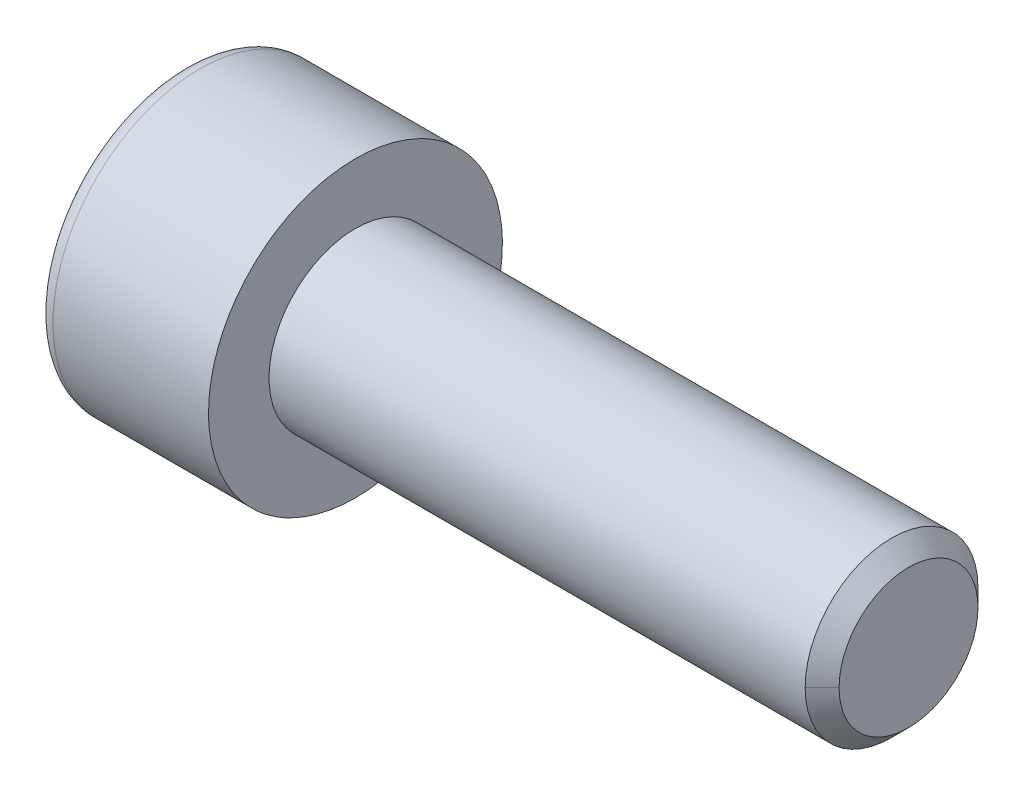
ISO-10303-21;
HEADER;
FILE_DESCRIPTION(('STEP AP214'),'2;1');
FILE_NAME('part.step','',(''),(''),'','','');
FILE_SCHEMA(('AUTOMOTIVE_DESIGN { 1 0 10303 214 1 1 1 1 }'));
ENDSEC;
DATA;
#1=APPLICATION_CONTEXT('core data for automotive mechanical design processes');
#2=APPLICATION_PROTOCOL_DEFINITION('international standard','automotive_design',2000,#1);
#3=PRODUCT_CONTEXT('',#1,'mechanical');
#4=PRODUCT('Part','Part','',(#3));
#5=PRODUCT_RELATED_PRODUCT_CATEGORY('part','',(#4));
#6=PRODUCT_DEFINITION_FORMATION('','',#4);
#7=PRODUCT_DEFINITION_CONTEXT('part definition',#1,'design');
#8=PRODUCT_DEFINITION('design','',#6,#7);
#9=PRODUCT_DEFINITION_SHAPE('','',#8);
#10=(LENGTH_UNIT() NAMED_UNIT(*) SI_UNIT(.MILLI.,.METRE.));
#11=(NAMED_UNIT(*) PLANE_ANGLE_UNIT() SI_UNIT($,.RADIAN.));
#12=(NAMED_UNIT(*) SI_UNIT($,.STERADIAN.) SOLID_ANGLE_UNIT());
#13=UNCERTAINTY_MEASURE_WITH_UNIT(LENGTH_MEASURE(1.E-05),#10,'distance_accuracy_value','');
#14=(GEOMETRIC_REPRESENTATION_CONTEXT(3) GLOBAL_UNCERTAINTY_ASSIGNED_CONTEXT((#13)) GLOBAL_UNIT_ASSIGNED_CONTEXT((#10,
#11,#12)) REPRESENTATION_CONTEXT('',''));
#15=CARTESIAN_POINT('',(0.,0.,0.));
#16=DIRECTION('',(0.,0.,1.));
#17=DIRECTION('',(1.,0.,0.));
#18=AXIS2_PLACEMENT_3D('',#15,#16,#17);
#19=CARTESIAN_POINT('',(16.,-2.03335088,-2.03335088));
#20=DIRECTION('',(1.,0.,0.));
#21=DIRECTION('',(0.,1.,0.));
#22=AXIS2_PLACEMENT_3D('',#19,#20,#21);
#23=PLANE('',#22);
#24=CARTESIAN_POINT('',(16.,0.,0.));
#25=DIRECTION('',(-1.,0.,0.));
#26=DIRECTION('',(0.,0.,1.));
#27=AXIS2_PLACEMENT_3D('',#24,#25,#26);
#28=CIRCLE('',#27,2.00924);
#29=CARTESIAN_POINT('',(16.,-6.86836687895213E-10,-2.00923999999999));
#30=VERTEX_POINT('',#29);
#31=CARTESIAN_POINT('',(16.,-2.40554743613262E-10,2.00923999999999));
#32=VERTEX_POINT('',#31);
#33=EDGE_CURVE('E88',#30,#32,#28,.F.);
#34=ORIENTED_EDGE('',*,*,#33,.T.);
#35=CARTESIAN_POINT('',(16.,0.,0.));
#36=DIRECTION('',(-1.,0.,0.));
#37=DIRECTION('',(0.,0.,1.));
#38=AXIS2_PLACEMENT_3D('',#35,#36,#37);
#39=CIRCLE('',#38,2.00924);
#40=EDGE_CURVE('E21',#32,#30,#39,.F.);
#41=ORIENTED_EDGE('',*,*,#40,.T.);
#42=EDGE_LOOP('',(#34,#41));
#43=FACE_BOUND('',#42,.T.);
#44=ADVANCED_FACE('F17',(#43),#23,.T.);
#45=CARTESIAN_POINT('',(16.,0.,2.00924));
#46=CARTESIAN_POINT('',(15.50924,0.,2.5));
#47=(BOUNDED_CURVE() B_SPLINE_CURVE(1,(#45,#46),.UNSPECIFIED.,.F.,
.F.) B_SPLINE_CURVE_WITH_KNOTS((2,2),(0.,1.00000000000005),
.UNSPECIFIED.) CURVE() GEOMETRIC_REPRESENTATION_ITEM() RATIONAL_B_SPLINE_CURVE((1.,1.)) REPRESENTATION_ITEM(''));
#48=CARTESIAN_POINT('',(1015.50924,0.,0.));
#49=DIRECTION('',(-1.,0.,0.));
#50=AXIS1_PLACEMENT('',#48,#49);
#51=SURFACE_OF_REVOLUTION('',#47,#50);
#52=ORIENTED_EDGE('',*,*,#40,.F.);
#53=DIRECTION('',(-0.707106781186547,-1.26986739101621E-10,0.707106781186548));
#54=VECTOR('',#53,1.);
#55=CARTESIAN_POINT('',(15.75462,-4.04899018551151E-10,2.25462));
#56=LINE('',#55,#54);
#57=CARTESIAN_POINT('',(15.50924,-2.244829608488E-10,2.49999999999995));
#58=VERTEX_POINT('',#57);
#59=EDGE_CURVE('E91',#32,#58,#56,.T.);
#60=ORIENTED_EDGE('',*,*,#59,.T.);
#61=CARTESIAN_POINT('',(15.5092400000001,0.,0.));
#62=DIRECTION('',(-1.,0.,0.));
#63=DIRECTION('',(0.,0.,1.));
#64=AXIS2_PLACEMENT_3D('',#61,#62,#63);
#65=CIRCLE('',#64,2.5);
#66=CARTESIAN_POINT('',(15.50924,-1.02551714257664E-09,-2.49999999999995));
#67=VERTEX_POINT('',#66);
#68=EDGE_CURVE('E95',#58,#67,#65,.F.);
#69=ORIENTED_EDGE('',*,*,#68,.T.);
#70=DIRECTION('',(0.707106781186547,2.90060050295602E-10,0.707106781186548));
#71=VECTOR('',#70,1.);
#72=CARTESIAN_POINT('',(15.75462,-9.24860583998472E-10,-2.25462));
#73=LINE('',#72,#71);
#74=EDGE_CURVE('E93',#67,#30,#73,.T.);
#75=ORIENTED_EDGE('',*,*,#74,.T.);
#76=EDGE_LOOP('',(#52,#60,#69,#75));
#77=FACE_BOUND('',#76,.T.);
#78=ADVANCED_FACE('F94',(#77),#51,.T.);
#79=CARTESIAN_POINT('',(16.0001414213562,0.,2.00909857864376));
#80=CARTESIAN_POINT('',(16.,0.,2.00924));
#81=CARTESIAN_POINT('',(15.50924,0.,2.5));
#82=(BOUNDED_CURVE() B_SPLINE_CURVE(1,(#79,#80,#81),.UNSPECIFIED.,.F.,
.F.) B_SPLINE_CURVE_WITH_KNOTS((2,1,2),(-0.000288168018237941,3.99405198964098E-11,1.),
.UNSPECIFIED.) CURVE() GEOMETRIC_REPRESENTATION_ITEM() RATIONAL_B_SPLINE_CURVE((1.,1.,1.)) REPRESENTATION_ITEM(''));
#83=CARTESIAN_POINT('',(1015.50924,0.,0.));
#84=DIRECTION('',(-1.,0.,0.));
#85=AXIS1_PLACEMENT('',#83,#84);
#86=SURFACE_OF_REVOLUTION('',#82,#85);
#87=ORIENTED_EDGE('',*,*,#74,.F.);
#88=CARTESIAN_POINT('',(15.5092400000001,0.,0.));
#89=DIRECTION('',(-1.,0.,0.));
#90=DIRECTION('',(0.,0.,1.));
#91=AXIS2_PLACEMENT_3D('',#88,#89,#90);
#92=CIRCLE('',#91,2.5);
#93=EDGE_CURVE('E108',#67,#58,#92,.F.);
#94=ORIENTED_EDGE('',*,*,#93,.T.);
#95=ORIENTED_EDGE('',*,*,#59,.F.);
#96=ORIENTED_EDGE('',*,*,#33,.F.);
#97=EDGE_LOOP('',(#87,#94,#95,#96));
#98=FACE_BOUND('',#97,.T.);
#99=ADVANCED_FACE('F101',(#98),#86,.T.);
#100=CARTESIAN_POINT('',(-1.166666666,0.,0.));
#101=CARTESIAN_POINT('',(-2.508,0.,2.323257483));
#102=(BOUNDED_CURVE() B_SPLINE_CURVE(1,(#100,#101),.UNSPECIFIED.,.F.,
.F.) B_SPLINE_CURVE_WITH_KNOTS((2,2),(0.,1.),
.UNSPECIFIED.) CURVE() GEOMETRIC_REPRESENTATION_ITEM() RATIONAL_B_SPLINE_CURVE((1.,1.)) REPRESENTATION_ITEM(''));
#103=CARTESIAN_POINT('',(997.492,0.,0.));
#104=DIRECTION('',(-1.,0.,0.));
#105=AXIS1_PLACEMENT('',#103,#104);
#106=SURFACE_OF_REVOLUTION('',#102,#105);
#107=CARTESIAN_POINT('',(-1.166666666,0.,0.));
#108=VERTEX_POINT('',#107);
#109=VERTEX_LOOP('',#108);
#110=FACE_BOUND('',#109,.T.);
#111=CARTESIAN_POINT('',(-2.49999999994076,-2.,-1.15470053775231));
#112=CARTESIAN_POINT('',(-2.48567655165512,-2.,-1.10507931773432));
#113=CARTESIAN_POINT('',(-2.47198871078964,-2.,-1.05526823641219));
#114=CARTESIAN_POINT('',(-2.44604690640692,-2.,-0.955218692575869));
#115=CARTESIAN_POINT('',(-2.43379447460794,-2.,-0.904979833791241));
#116=CARTESIAN_POINT('',(-2.41091380130688,-2.,-0.804117092943882));
#117=CARTESIAN_POINT('',(-2.40028604275163,-2.,-0.753493101073635));
#118=CARTESIAN_POINT('',(-2.37601016772818,-2.,-0.626639542162072));
#119=CARTESIAN_POINT('',(-2.36348630626666,-2.,-0.550189309523977));
#120=CARTESIAN_POINT('',(-2.34306885503139,-2.,-0.396671574205417));
#121=CARTESIAN_POINT('',(-2.33517516655927,-2.,-0.319604084718113));
#122=CARTESIAN_POINT('',(-2.32268432555711,-2.,-0.139619688842338));
#123=CARTESIAN_POINT('',(-2.32003239400898,-2.,-0.0365584864338747));
#124=CARTESIAN_POINT('',(-2.32397535370215,-2.,0.169407104774963));
#125=CARTESIAN_POINT('',(-2.33057305877728,-2.,0.272311436318865));
#126=CARTESIAN_POINT('',(-2.35234479113069,-2.,0.477116467372633));
#127=CARTESIAN_POINT('',(-2.36751355138492,-2.,0.579017744182629));
#128=CARTESIAN_POINT('',(-2.40514304704038,-2.,0.781457900875611));
#129=CARTESIAN_POINT('',(-2.42760505461591,-2.,0.881996539881626));
#130=CARTESIAN_POINT('',(-2.46035679018023,-2.,1.01073167838896));
#131=CARTESIAN_POINT('',(-2.46797293838578,-2.,1.03963527257175));
#132=CARTESIAN_POINT('',(-2.48365524704736,-2.,1.09727927796046));
#133=CARTESIAN_POINT('',(-2.49172080087081,-2.,1.12601985408537));
#134=CARTESIAN_POINT('',(-2.49999999998173,-2.,1.15470053789423));
#135=B_SPLINE_CURVE_WITH_KNOTS('',3,(#111,#112,#113,#114,#115,#116,#117,#118,#119,#120,#121,
#122,#123,#124,#125,#126,#127,#128,#129,#130,#131,#132,#133,#134),.UNSPECIFIED.,.F.,.F.,(4,2,2,
2,2,2,2,2,2,2,2,4),(0.,0.154946742163082,0.310057349590026,0.465213975574503,0.697487987448034,
0.929757047907446,1.23861321261436,1.54756335490868,1.85632384950566,2.16513823071313,
2.25480717406297,2.34435787914655),.UNSPECIFIED.);
#136=CARTESIAN_POINT('',(-2.4999999998186,-1.99999999993079,-1.15470053803996));
#137=VERTEX_POINT('',#136);
#138=CARTESIAN_POINT('',(-2.49999999995344,-1.99999999986934,1.15470053802255));
#139=VERTEX_POINT('',#138);
#140=EDGE_CURVE('E400',#137,#139,#135,.T.);
#141=ORIENTED_EDGE('',*,*,#140,.T.);
#142=CARTESIAN_POINT('',(-2.49999999992515,-1.99999999973868,1.15470053815087));
#143=CARTESIAN_POINT('',(-2.48567655163891,-1.95702676264271,1.17951114816952));
#144=CARTESIAN_POINT('',(-2.47198871077284,-1.91388910083416,1.20441668884029));
#145=CARTESIAN_POINT('',(-2.44604690638884,-1.82724365424769,1.25444146077793));
#146=CARTESIAN_POINT('',(-2.43379447458918,-1.78373552628951,1.27956089018003));
#147=CARTESIAN_POINT('',(-2.4109138012866,-1.6963858304333,1.32999226062335));
#148=CARTESIAN_POINT('',(-2.40028604273051,-1.65254416743919,1.35530425656833));
#149=CARTESIAN_POINT('',(-2.37601016770505,-1.54268576287784,1.41873103604867));
#150=CARTESIAN_POINT('',(-2.36348630624236,-1.47647791929806,1.45695615238246));
#151=CARTESIAN_POINT('',(-2.3430688550045,-1.34352766060085,1.5337150200714));
#152=CARTESIAN_POINT('',(-2.33517516653094,-1.27678525690902,1.57224876482995));
#153=CARTESIAN_POINT('',(-2.32268432552556,-1.1209141978217,1.66224096280127));
#154=CARTESIAN_POINT('',(-2.32003239397535,-1.03166057840722,1.71377156402406));
#155=CARTESIAN_POINT('',(-2.32397535366393,-0.853289144146355,1.81675435966568));
#156=CARTESIAN_POINT('',(-2.33057305873656,-0.764171378885523,1.86820652545626));
#157=CARTESIAN_POINT('',(-2.35234479108477,-0.586805019200706,1.97060904102052));
#158=CARTESIAN_POINT('',(-2.36751355133635,-0.498555924820148,2.02155967944427));
#159=CARTESIAN_POINT('',(-2.40514304698655,-0.32323760640756,2.12277975782806));
#160=CARTESIAN_POINT('',(-2.4276050545595,-0.236168590981107,2.17304907734962));
#161=CARTESIAN_POINT('',(-2.46035679014959,-0.124680690593866,2.23741664668419));
#162=CARTESIAN_POINT('',(-2.46797293838541,-0.0996494436766156,2.25186844383778));
#163=CARTESIAN_POINT('',(-2.48365524711095,-0.0497282704466456,2.28069044665586));
#164=CARTESIAN_POINT('',(-2.4917208009681,-0.024838201309885,2.29506073477984));
#165=CARTESIAN_POINT('',(-2.50000000011427,-4.40704641312993E-10,2.30940107674556));
#166=B_SPLINE_CURVE_WITH_KNOTS('',3,(#142,#143,#144,#145,#146,#147,#148,#149,#150,#151,#152,
#153,#154,#155,#156,#157,#158,#159,#160,#161,#162,#163,#164,#165),.UNSPECIFIED.,.F.,.F.,(4,2,2,
2,2,2,2,2,2,2,2,4),(0.,0.154946742161569,0.310057349586999,0.465213975569957,0.697487987440142,
0.929757047896212,1.23861321259006,1.54756335487124,1.85632384945638,2.16513823065216,
2.25480717435215,2.34435787978498),.UNSPECIFIED.);
#167=CARTESIAN_POINT('',(-2.50000000028077,-5.87977686074181E-11,2.30940107703395));
#168=VERTEX_POINT('',#167);
#169=EDGE_CURVE('E409',#139,#168,#166,.T.);
#170=ORIENTED_EDGE('',*,*,#169,.T.);
#171=CARTESIAN_POINT('',(-2.50000000016212,2.97141322209485E-10,2.30940107682845));
#172=CARTESIAN_POINT('',(-2.48567655186644,0.0429732373984809,2.2845904668067));
#173=CARTESIAN_POINT('',(-2.4719887109907,0.0861108992124214,2.25968492613282));
#174=CARTESIAN_POINT('',(-2.44604690658692,0.172756345809803,2.20966015418887));
#175=CARTESIAN_POINT('',(-2.43379447477714,0.216264473773518,2.18454072478358));
#176=CARTESIAN_POINT('',(-2.4109138014539,0.303614169640957,2.13410935433377));
#177=CARTESIAN_POINT('',(-2.40028604288728,0.347455832640779,2.1087973583855));
#178=CARTESIAN_POINT('',(-2.37601016783492,0.457314237217623,2.04537057889622));
#179=CARTESIAN_POINT('',(-2.36348630635573,0.523522080807346,2.00714546255668));
#180=CARTESIAN_POINT('',(-2.34306885508494,0.656472339525236,1.93038659485581));
#181=CARTESIAN_POINT('',(-2.33517516659494,0.723214743227788,1.89185285009106));
#182=CARTESIAN_POINT('',(-2.32268432555431,0.879085802316307,1.80186065211906));
#183=CARTESIAN_POINT('',(-2.32003239398313,0.968339421721444,1.75033005090165));
#184=CARTESIAN_POINT('',(-2.32397535362841,1.14671085596532,1.64734725526985));
#185=CARTESIAN_POINT('',(-2.3305730586787,1.2358286212185,1.59589508948368));
#186=CARTESIAN_POINT('',(-2.35234479098305,1.41319498088894,1.49349257392772));
#187=CARTESIAN_POINT('',(-2.36751355121305,1.50144407526278,1.44254193550786));
#188=CARTESIAN_POINT('',(-2.40514304682218,1.67676239366279,1.34132185713132));
#189=CARTESIAN_POINT('',(-2.42760505437561,1.76383140908338,1.29105253761314));
#190=CARTESIAN_POINT('',(-2.46035678994391,1.87531930946905,1.22668496827949));
#191=CARTESIAN_POINT('',(-2.46797293817638,1.90035055639045,1.2122331711235));
#192=CARTESIAN_POINT('',(-2.48365524689563,1.95027172962873,1.18341116830062));
#193=CARTESIAN_POINT('',(-2.49172080074984,1.97516179876965,1.16904088017424));
#194=CARTESIAN_POINT('',(-2.49999999989325,1.99999999964298,1.15470053820613));
#195=B_SPLINE_CURVE_WITH_KNOTS('',3,(#171,#172,#173,#174,#175,#176,#177,#178,#179,#180,#181,
#182,#183,#184,#185,#186,#187,#188,#189,#190,#191,#192,#193,#194),.UNSPECIFIED.,.F.,.F.,(4,2,2,
2,2,2,2,2,2,2,2,4),(0.,0.154946742187278,0.310057349638523,0.465213975647335,0.69748798755956,
0.92975704805761,1.23861321272094,1.54756335497137,1.85632384952381,2.16513823068683,
2.25480717439816,2.34435787984248),.UNSPECIFIED.);
#196=CARTESIAN_POINT('',(-2.49999999995344,1.99999999982149,1.15470053810544));
#197=VERTEX_POINT('',#196);
#198=EDGE_CURVE('E418',#168,#197,#195,.T.);
#199=ORIENTED_EDGE('',*,*,#198,.T.);
#200=CARTESIAN_POINT('',(-2.50000000001363,2.,1.15470053800475));
#201=CARTESIAN_POINT('',(-2.48567655172505,2.,1.10507931798486));
#202=CARTESIAN_POINT('',(-2.47198871085661,2.,1.05526823666081));
#203=CARTESIAN_POINT('',(-2.44604690646785,2.,0.955218692820608));
#204=CARTESIAN_POINT('',(-2.43379447466577,2.,0.904979834034012));
#205=CARTESIAN_POINT('',(-2.41091380135833,2.,0.804117093182673));
#206=CARTESIAN_POINT('',(-2.40028604279979,2.,0.753493101310414));
#207=CARTESIAN_POINT('',(-2.37601016776802,2.,0.626639542393354));
#208=CARTESIAN_POINT('',(-2.36348630630148,2.,0.550189309751709));
#209=CARTESIAN_POINT('',(-2.34306885505614,2.,0.396671574425779));
#210=CARTESIAN_POINT('',(-2.33517516657896,2.,0.319604084934656));
#211=CARTESIAN_POINT('',(-2.32268432556593,2.,0.139619689058439));
#212=CARTESIAN_POINT('',(-2.32003239401132,2.,0.0365584866532823));
#213=CARTESIAN_POINT('',(-2.32397535369116,2.,-0.169407104549539));
#214=CARTESIAN_POINT('',(-2.33057305875947,2.,-0.272311436090732));
#215=CARTESIAN_POINT('',(-2.3523447910994,2.,-0.477116467139405));
#216=CARTESIAN_POINT('',(-2.36751355134697,2.,-0.579017743947016));
#217=CARTESIAN_POINT('',(-2.40514304698976,2.,-0.781457900635529));
#218=CARTESIAN_POINT('',(-2.42760505455929,2.,-0.881996539639461));
#219=CARTESIAN_POINT('',(-2.46035679011629,2.,-1.01073167814332));
#220=CARTESIAN_POINT('',(-2.46797293832006,2.,-1.03963527232473));
#221=CARTESIAN_POINT('',(-2.48365524697808,2.,-1.0972792777107));
#222=CARTESIAN_POINT('',(-2.49172080079975,2.,-1.12601985383426));
#223=CARTESIAN_POINT('',(-2.49999999990886,2.,-1.1547005376418));
#224=B_SPLINE_CURVE_WITH_KNOTS('',3,(#200,#201,#202,#203,#204,#205,#206,#207,#208,#209,#210,
#211,#212,#213,#214,#215,#216,#217,#218,#219,#220,#221,#222,#223),.UNSPECIFIED.,.F.,.F.,(4,2,2,
2,2,2,2,2,2,2,2,4),(0.,0.154946742170985,0.310057349605864,0.465213975598284,0.697487987484767,
0.929757047957124,1.23861321265468,1.54756335493957,1.85632384952649,2.16513823072387,
2.2548071740683,2.34435787914655),.UNSPECIFIED.);
#225=CARTESIAN_POINT('',(-2.49999999995344,1.99999999997865,-1.15470053783323));
#226=VERTEX_POINT('',#225);
#227=EDGE_CURVE('E427',#197,#226,#224,.T.);
#228=ORIENTED_EDGE('',*,*,#227,.T.);
#229=CARTESIAN_POINT('',(-2.49999999999803,1.9999999999573,-1.15470053802466));
#230=CARTESIAN_POINT('',(-2.48567655170877,1.95702676285955,-1.17951114804433));
#231=CARTESIAN_POINT('',(-2.4719887108397,1.9138891010492,-1.20441668871613));
#232=CARTESIAN_POINT('',(-2.44604690644962,1.8272436544591,-1.25444146065587));
#233=CARTESIAN_POINT('',(-2.43379447464687,1.78373552649906,-1.27956089005904));
#234=CARTESIAN_POINT('',(-2.41091380133792,1.69638583063912,-1.32999226050452));
#235=CARTESIAN_POINT('',(-2.40028604277855,1.65254416764312,-1.35530425645059));
#236=CARTESIAN_POINT('',(-2.37601016774484,1.54268576307708,-1.41873103593363));
#237=CARTESIAN_POINT('',(-2.36348630627713,1.47647791949446,-1.45695615226908));
#238=CARTESIAN_POINT('',(-2.34306885502922,1.34352766079131,-1.53371501996143));
#239=CARTESIAN_POINT('',(-2.33517516655063,1.2767852570964,-1.57224876472177));
#240=CARTESIAN_POINT('',(-2.32268432553439,1.12091419800915,-1.66224096269304));
#241=CARTESIAN_POINT('',(-2.32003239397769,1.03166057859777,-1.71377156391405));
#242=CARTESIAN_POINT('',(-2.32397535365287,0.853289144342585,-1.81675435955238));
#243=CARTESIAN_POINT('',(-2.33057305871859,0.76417137908434,-1.86820652534147));
#244=CARTESIAN_POINT('',(-2.35234479105324,0.586805019403965,-1.97060904090317));
#245=CARTESIAN_POINT('',(-2.3675135512982,0.498555925025262,-2.02155967932584));
#246=CARTESIAN_POINT('',(-2.40514304693586,0.323237606616101,-2.12277975770766));
#247=CARTESIAN_POINT('',(-2.42760505450289,0.236168591191219,-2.17304907722831));
#248=CARTESIAN_POINT('',(-2.46035679011618,0.124680690702564,-2.23741664662143));
#249=CARTESIAN_POINT('',(-2.4679729383828,0.0996494436828631,-2.25186844383417));
#250=CARTESIAN_POINT('',(-2.48365524717361,0.0497282702491337,-2.28069044676989));
#251=CARTESIAN_POINT('',(-2.49172080106521,0.0248382010110627,-2.29506073495237));
#252=CARTESIAN_POINT('',(-2.5000000002475,4.09998984578272E-11,-2.30940107697633));
#253=B_SPLINE_CURVE_WITH_KNOTS('',3,(#229,#230,#231,#232,#233,#234,#235,#236,#237,#238,#239,
#240,#241,#242,#243,#244,#245,#246,#247,#248,#249,#250,#251,#252),.UNSPECIFIED.,.F.,.F.,(4,2,2,
2,2,2,2,2,2,2,2,4),(0.,0.154946742169962,0.310057349603811,0.465213975595197,0.697487987477565,
0.929757047945802,1.23861321262949,1.5475633549004,1.8563238494762,2.16513823066278,
2.25480717472947,2.34435788052809),.UNSPECIFIED.);
#254=CARTESIAN_POINT('',(-2.50000000026117,-9.47332157419396E-10,-2.309401077));
#255=VERTEX_POINT('',#254);
#256=EDGE_CURVE('E436',#226,#255,#253,.T.);
#257=ORIENTED_EDGE('',*,*,#256,.T.);
#258=CARTESIAN_POINT('',(-2.50000000002889,-6.96845553583441E-10,-2.30940107659768));
#259=CARTESIAN_POINT('',(-2.48567655173841,-0.0429732377951086,-2.28459046657771));
#260=CARTESIAN_POINT('',(-2.47198871086813,-0.0861108996059853,-2.2596849259056));
#261=CARTESIAN_POINT('',(-2.4460469064756,-0.172756346197175,-2.20966015396523));
#262=CARTESIAN_POINT('',(-2.4337944746716,-0.216264474157762,-2.18454072456174));
#263=CARTESIAN_POINT('',(-2.41091380136002,-0.303614170018815,-2.13410935411562));
#264=CARTESIAN_POINT('',(-2.40028604279926,-0.347455833015379,-2.10879735816922));
#265=CARTESIAN_POINT('',(-2.37601016776189,-0.457314237583502,-2.04537057868498));
#266=CARTESIAN_POINT('',(-2.36348630629192,-0.523522081167679,-2.00714546234864));
#267=CARTESIAN_POINT('',(-2.34306885503964,-0.65647233987405,-1.93038659465442));
#268=CARTESIAN_POINT('',(-2.33517516655893,-0.72321474357063,-1.89185284989312));
#269=CARTESIAN_POINT('',(-2.32268432553819,-0.879085802658592,-1.80186065192144));
#270=CARTESIAN_POINT('',(-2.3200323939788,-0.968339422069034,-1.75033005070097));
#271=CARTESIAN_POINT('',(-2.32397535364841,-1.14671085632258,-1.64734725506358));
#272=CARTESIAN_POINT('',(-2.33057305871125,-1.23582862158012,-1.5958950892749));
#273=CARTESIAN_POINT('',(-2.35234479104024,-1.41319498125865,-1.49349257371427));
#274=CARTESIAN_POINT('',(-2.36751355128237,-1.50144407563621,-1.44254193529225));
#275=CARTESIAN_POINT('',(-2.4051430469146,-1.67676239404317,-1.34132185691171));
#276=CARTESIAN_POINT('',(-2.42760505447902,-1.763831409467,-1.29105253739166));
#277=CARTESIAN_POINT('',(-2.46035679005192,-1.87531930982753,-1.22668496807252));
#278=CARTESIAN_POINT('',(-2.46797293827813,-1.90035055672077,-1.21223317093279));
#279=CARTESIAN_POINT('',(-2.48365524698376,-1.950271729903,-1.18341116814227));
#280=CARTESIAN_POINT('',(-2.49172080083059,-1.97516179901603,-1.16904088003199));
#281=CARTESIAN_POINT('',(-2.49999999996612,-1.99999999986159,-1.15470053807991));
#282=B_SPLINE_CURVE_WITH_KNOTS('',3,(#258,#259,#260,#261,#262,#263,#264,#265,#266,#267,#268,
#269,#270,#271,#272,#273,#274,#275,#276,#277,#278,#279,#280,#281),.UNSPECIFIED.,.F.,.F.,(4,2,2,
2,2,2,2,2,2,2,2,4),(0.,0.154946742172695,0.310057349609295,0.465213975603437,0.697487987492204,
0.929757047966837,1.23861321264752,1.54756335491544,1.85632384948608,2.1651382306673,
2.2548071742795,2.34435787962486),.UNSPECIFIED.);
#283=EDGE_CURVE('E439',#255,#137,#282,.T.);
#284=ORIENTED_EDGE('',*,*,#283,.T.);
#285=EDGE_LOOP('',(#141,#170,#199,#228,#257,#284));
#286=FACE_BOUND('',#285,.T.);
#287=ADVANCED_FACE('F180',(#110,#286),#106,.F.);
#288=CARTESIAN_POINT('',(0.,2.5,0.));
#289=CARTESIAN_POINT('',(15.50924,2.5,0.));
#290=(BOUNDED_CURVE() B_SPLINE_CURVE(1,(#288,#289),.UNSPECIFIED.,.F.,
.F.) B_SPLINE_CURVE_WITH_KNOTS((2,2),(0.,1.),
.UNSPECIFIED.) CURVE() GEOMETRIC_REPRESENTATION_ITEM() RATIONAL_B_SPLINE_CURVE((1.,1.)) REPRESENTATION_ITEM(''));
#291=CARTESIAN_POINT('',(9.2,0.,0.));
#292=DIRECTION('',(1.,0.,0.));
#293=AXIS1_PLACEMENT('',#291,#292);
#294=SURFACE_OF_REVOLUTION('',#290,#293);
#295=CARTESIAN_POINT('',(0.,2.5,-1.49654235150772E-10));
#296=CARTESIAN_POINT('',(0.,2.49999957935712,-0.0701921601458649));
#297=CARTESIAN_POINT('',(0.,2.49704119341874,-0.140397219847306));
#298=CARTESIAN_POINT('',(0.,2.48522688335223,-0.280322179338116));
#299=CARTESIAN_POINT('',(0.,2.47636921808606,-0.350041929750868));
#300=CARTESIAN_POINT('',(0.,2.45279620031375,-0.488604766662132));
#301=CARTESIAN_POINT('',(0.,2.43807154939718,-0.557446281672286));
#302=CARTESIAN_POINT('',(0.,2.40286605984876,-0.693682439725407));
#303=CARTESIAN_POINT('',(0.,2.3823805500333,-0.761075860650563));
#304=CARTESIAN_POINT('',(0.,2.3125659555721,-0.960073508686272));
#305=CARTESIAN_POINT('',(0.,2.25482146131052,-1.0888300172892));
#306=CARTESIAN_POINT('',(0.,2.11850508049911,-1.33480670440696));
#307=CARTESIAN_POINT('',(0.,2.03993240221167,-1.45202644414458));
#308=CARTESIAN_POINT('',(0.,1.90824104287933,-1.61665670252642));
#309=CARTESIAN_POINT('',(0.,1.86200376385574,-1.66969790920959));
#310=CARTESIAN_POINT('',(0.,1.76526174320805,-1.77166010130448));
#311=CARTESIAN_POINT('',(0.,1.71476115904218,-1.82058500992368));
#312=CARTESIAN_POINT('',(0.,1.60979378908777,-1.91402800851678));
#313=CARTESIAN_POINT('',(0.,1.55532521700593,-1.95854409219933));
#314=CARTESIAN_POINT('',(0.,1.44283652725317,-2.04283394027423));
#315=CARTESIAN_POINT('',(0.,1.384815589926,-2.08260660390377));
#316=CARTESIAN_POINT('',(0.,1.20605688640292,-2.19433902063112));
#317=CARTESIAN_POINT('',(0.,1.08051229837999,-2.25881176841051));
#318=CARTESIAN_POINT('',(0.,0.820448664808011,-2.36572576693554));
#319=CARTESIAN_POINT('',(0.,0.68592971512666,-2.40816725298534));
#320=CARTESIAN_POINT('',(0.,0.411658452676093,-2.46987540916738));
#321=CARTESIAN_POINT('',(0.,0.271906111962458,-2.48914195553559));
#322=CARTESIAN_POINT('',(0.,-0.00884938366135953,-2.50393336511555));
#323=CARTESIAN_POINT('',(0.,-0.149852538571541,-2.4994582283273));
#324=CARTESIAN_POINT('',(0.,-0.429089566460181,-2.46691127452929));
#325=CARTESIAN_POINT('',(0.,-0.567323454223614,-2.43883958353471));
#326=CARTESIAN_POINT('',(0.,-0.837181598048732,-2.35984414823284));
#327=CARTESIAN_POINT('',(0.,-0.968805783498485,-2.30892015985052));
#328=CARTESIAN_POINT('',(0.,-1.15831539859643,-2.21658970540334));
#329=CARTESIAN_POINT('',(0.,-1.22019432815808,-2.18313388353604));
#330=CARTESIAN_POINT('',(0.,-1.34091721232836,-2.11113062632916));
#331=CARTESIAN_POINT('',(0.,-1.39976186639087,-2.07258437178567));
#332=CARTESIAN_POINT('',(0.,-1.51396685336594,-1.99068831759965));
#333=CARTESIAN_POINT('',(0.,-1.56932875186804,-1.9473407008401));
#334=CARTESIAN_POINT('',(0.,-1.6762490953027,-1.85610831988026));
#335=CARTESIAN_POINT('',(0.,-1.72780381803106,-1.8082192173379));
#336=CARTESIAN_POINT('',(0.,-1.87606499403363,-1.65833806512721));
#337=CARTESIAN_POINT('',(0.,-1.96651979569876,-1.55002342155054));
#338=CARTESIAN_POINT('',(0.,-2.12792802530579,-1.31973215011787));
#339=CARTESIAN_POINT('',(0.,-2.19888219449693,-1.19775604180344));
#340=CARTESIAN_POINT('',(0.,-2.28922037065546,-1.00719593199043));
#341=CARTESIAN_POINT('',(0.,-2.31667397069351,-0.942328149992189));
#342=CARTESIAN_POINT('',(0.,-2.36599984787504,-0.810545468672519));
#343=CARTESIAN_POINT('',(0.,-2.38787664192646,-0.743632275537157));
#344=CARTESIAN_POINT('',(0.,-2.42587892397024,-0.60831349081281));
#345=CARTESIAN_POINT('',(0.,-2.44201349377068,-0.539910439061319));
#346=CARTESIAN_POINT('',(0.,-2.46846529093155,-0.402001503028459));
#347=CARTESIAN_POINT('',(0.,-2.47878423409518,-0.332495950250272));
#348=CARTESIAN_POINT('',(0.,-2.49076983986528,-0.219068891475801));
#349=CARTESIAN_POINT('',(0.,-2.49423005455374,-0.175328990224659));
#350=CARTESIAN_POINT('',(0.,-2.49884526605357,-0.0877277389086183));
#351=CARTESIAN_POINT('',(0.,-2.50000026286494,-0.0438663888437195));
#352=CARTESIAN_POINT('',(0.,-2.49999957938051,0.0701921593122001));
#353=CARTESIAN_POINT('',(0.,-2.49704119346556,0.140397219014432));
#354=CARTESIAN_POINT('',(0.,-2.48522688344576,0.280322178508838));
#355=CARTESIAN_POINT('',(0.,-2.47636921820289,0.350041928924395));
#356=CARTESIAN_POINT('',(0.,-2.45279620047681,0.48860476584359));
#357=CARTESIAN_POINT('',(0.,-2.43807154958317,0.557446280858869));
#358=CARTESIAN_POINT('',(0.,-2.40286606008009,0.693682438924113));
#359=CARTESIAN_POINT('',(0.,-2.38238055028705,0.76107585985627));
#360=CARTESIAN_POINT('',(0.,-2.31256595589212,0.960073507915409));
#361=CARTESIAN_POINT('',(0.,-2.25482146167347,1.08883001653758));
#362=CARTESIAN_POINT('',(0.,-2.11850508094405,1.33480670370078));
#363=CARTESIAN_POINT('',(0.,-2.03993240269569,1.4520264434646));
#364=CARTESIAN_POINT('',(0.,-1.90824104341822,1.61665670189033));
#365=CARTESIAN_POINT('',(0.,-1.86200376441232,1.66969790858891));
#366=CARTESIAN_POINT('',(0.,-1.76526174379863,1.77166010071603));
#367=CARTESIAN_POINT('',(0.,-1.71476115964908,1.82058500935206));
#368=CARTESIAN_POINT('',(0.,-1.60979378972582,1.91402800798015));
#369=CARTESIAN_POINT('',(0.,-1.55532521765881,1.95854409168086));
#370=CARTESIAN_POINT('',(0.,-1.44283652793413,2.04283393979327));
#371=CARTESIAN_POINT('',(0.,-1.38481559062021,2.08260660344216));
#372=CARTESIAN_POINT('',(0.,-1.20605688713436,2.1943390202291));
#373=CARTESIAN_POINT('',(0.,-1.08051229913292,2.25881176805034));
#374=CARTESIAN_POINT('',(0.,-0.820448665596574,2.36572576666206));
#375=CARTESIAN_POINT('',(0.,-0.685929715929375,2.4081672527567));
#376=CARTESIAN_POINT('',(0.,-0.411658453499383,2.46987540903016));
#377=CARTESIAN_POINT('',(0.,-0.27190611279217,2.48914195544496));
#378=CARTESIAN_POINT('',(0.,0.0088493828267163,2.5039333651185));
#379=CARTESIAN_POINT('',(0.,0.149852537738391,2.49945822837725));
#380=CARTESIAN_POINT('',(0.,0.429089565637885,2.46691127467232));
#381=CARTESIAN_POINT('',(0.,0.56732345341068,2.43883958372382));
#382=CARTESIAN_POINT('',(0.,0.837181597262129,2.3598441485119));
#383=CARTESIAN_POINT('',(0.,0.968805782728852,2.30892016017345));
#384=CARTESIAN_POINT('',(0.,1.15831539785756,2.21658970578945));
#385=CARTESIAN_POINT('',(0.,1.22019432743036,2.18313388394278));
#386=CARTESIAN_POINT('',(0.,1.34091721162461,2.11113062677616));
#387=CARTESIAN_POINT('',(0.,1.39976186569996,2.07258437225229));
#388=CARTESIAN_POINT('',(0.,1.51396685270234,1.99068831810434));
#389=CARTESIAN_POINT('',(0.,1.56932875121889,1.94734070136323));
#390=CARTESIAN_POINT('',(0.,1.67624909468398,1.85610832043902));
#391=CARTESIAN_POINT('',(0.,1.72780381742832,1.80821921791384));
#392=CARTESIAN_POINT('',(0.,1.87606499348084,1.65833806575257));
#393=CARTESIAN_POINT('',(0.,1.96651979518207,1.55002342220605));
#394=CARTESIAN_POINT('',(0.,2.12792802486587,1.31973215082719));
#395=CARTESIAN_POINT('',(0.,2.19888219409767,1.1977560425364));
#396=CARTESIAN_POINT('',(0.,2.28922037031966,1.00719593275366));
#397=CARTESIAN_POINT('',(0.,2.31667397037926,0.942328150764739));
#398=CARTESIAN_POINT('',(0.,2.36599984760461,0.810545469461889));
#399=CARTESIAN_POINT('',(0.,2.38787664167829,0.743632276334033));
#400=CARTESIAN_POINT('',(0.,2.42587892376722,0.608313491622432));
#401=CARTESIAN_POINT('',(0.,2.44201349359053,0.539910439876176));
#402=CARTESIAN_POINT('',(0.,2.46846529079747,0.402001503851801));
#403=CARTESIAN_POINT('',(0.,2.47878423398432,0.332495951076861));
#404=CARTESIAN_POINT('',(0.,2.49076983982144,0.219068892029809));
#405=CARTESIAN_POINT('',(0.,2.49423005453912,0.175328990502047));
#406=CARTESIAN_POINT('',(0.,2.49884526606818,0.0877277386312282));
#407=CARTESIAN_POINT('',(0.,2.50000026287956,0.0438663882881707));
#408=CARTESIAN_POINT('',(0.,2.5,-1.49654235150772E-10));
#409=B_SPLINE_CURVE_WITH_KNOTS('',3,(#295,#296,#297,#298,#299,#300,#301,#302,#303,#304,#305,
#306,#307,#308,#309,#310,#311,#312,#313,#314,#315,#316,#317,#318,#319,#320,#321,#322,#323,#324,
#325,#326,#327,#328,#329,#330,#331,#332,#333,#334,#335,#336,#337,#338,#339,#340,#341,#342,#343,
#344,#345,#346,#347,#348,#349,#350,#351,#352,#353,#354,#355,#356,#357,#358,#359,#360,#361,#362,
#363,#364,#365,#366,#367,#368,#369,#370,#371,#372,#373,#374,#375,#376,#377,#378,#379,#380,#381,
#382,#383,#384,#385,#386,#387,#388,#389,#390,#391,#392,#393,#394,#395,#396,#397,#398,#399,#400,
#401,#402,#403,#404,#405,#406,#407,#408),.UNSPECIFIED.,.T.,.F.,(4,2,2,2,2,2,2,2,2,2,2,2,2,2,2,2,
2,2,2,2,2,2,2,2,2,2,2,2,2,2,2,2,2,2,2,2,2,2,2,2,2,2,2,2,2,2,2,2,2,2,2,2,2,2,2,2,4),(0.,
0.210536096820452,0.421134359699887,0.632067729618859,0.843172630152281,1.26437611909931,
1.6855956214669,1.89648135010458,2.1071637531372,2.31794159353163,2.52876825245848,
2.94998199754241,3.3711912437741,3.79240273943195,4.2136142350898,4.63482348132148,
5.05603722640542,5.26686388533231,5.47764172572677,5.68832412875935,5.89920985739701,
6.32042935976462,6.74163284871162,6.95273774924558,7.16367111916518,7.37426938204421,
7.5848054788639,7.71637940599957,7.84795333313523,8.05848942995493,8.26908769283395,
8.48002106275356,8.69112596328752,9.11232945223452,9.53354895460213,9.74443468323978,
9.95511708627237,10.1658949266668,10.3767215855937,10.7979353306777,11.2191445769093,
11.6403560725672,12.061567568225,12.4827768144567,12.9039905595407,13.1148172184675,
13.3255950588619,13.5362774618946,13.7471631905322,14.1683826928998,14.5895861818469,
14.8006910823803,15.0116244522992,15.2222227151787,15.4327588119991,15.5643327399678,
15.6959066679366),.UNSPECIFIED.);
#410=CARTESIAN_POINT('',(0.,2.5,-1.49654235150772E-10));
#411=VERTEX_POINT('',#410);
#412=EDGE_CURVE('E384',#411,#411,#409,.T.);
#413=ORIENTED_EDGE('',*,*,#412,.F.);
#414=EDGE_LOOP('',(#413));
#415=FACE_BOUND('',#414,.T.);
#416=ORIENTED_EDGE('',*,*,#68,.F.);
#417=ORIENTED_EDGE('',*,*,#93,.F.);
#418=EDGE_LOOP('',(#416,#417));
#419=FACE_BOUND('',#418,.T.);
#420=ADVANCED_FACE('F173',(#415,#419),#294,.T.);
#421=CARTESIAN_POINT('',(-5.,-2.,-1.154700538));
#422=DIRECTION('',(0.,-0.500000000201594,-0.866025403668048));
#423=DIRECTION('',(0.,0.866025403668048,-0.500000000201594));
#424=AXIS2_PLACEMENT_3D('',#421,#422,#423);
#425=PLANE('',#424);
#426=DIRECTION('',(0.,0.866025403668048,-0.500000000201594));
#427=VECTOR('',#426,1.);
#428=CARTESIAN_POINT('',(-5.,-2.00000000003796,-1.15470053797809));
#429=LINE('',#428,#427);
#430=CARTESIAN_POINT('',(-5.,-2.,-1.154700538));
#431=VERTEX_POINT('',#430);
#432=CARTESIAN_POINT('',(-5.,0.,-2.309401077));
#433=VERTEX_POINT('',#432);
#434=EDGE_CURVE('E380',#431,#433,#429,.T.);
#435=ORIENTED_EDGE('',*,*,#434,.F.);
#436=DIRECTION('',(1.,0.,0.));
#437=VECTOR('',#436,1.);
#438=CARTESIAN_POINT('',(-5.,-2.,-1.154700538));
#439=LINE('',#438,#437);
#440=EDGE_CURVE('E390',#431,#137,#439,.T.);
#441=ORIENTED_EDGE('',*,*,#440,.T.);
#442=ORIENTED_EDGE('',*,*,#283,.F.);
#443=DIRECTION('',(1.,0.,0.));
#444=VECTOR('',#443,1.);
#445=CARTESIAN_POINT('',(-5.,0.,-2.309401077));
#446=LINE('',#445,#444);
#447=EDGE_CURVE('E430',#255,#433,#446,.F.);
#448=ORIENTED_EDGE('',*,*,#447,.T.);
#449=EDGE_LOOP('',(#435,#441,#442,#448));
#450=FACE_BOUND('',#449,.T.);
#451=ADVANCED_FACE('F179',(#450),#425,.F.);
#452=CARTESIAN_POINT('',(-5.,0.,-2.309401077));
#453=DIRECTION('',(0.,0.500000000201594,-0.866025403668048));
#454=DIRECTION('',(0.,0.866025403668048,0.500000000201594));
#455=AXIS2_PLACEMENT_3D('',#452,#453,#454);
#456=PLANE('',#455);
#457=DIRECTION('',(0.,0.866025403668048,0.500000000201594));
#458=VECTOR('',#457,1.);
#459=CARTESIAN_POINT('',(-5.,3.31831350591782E-10,-2.30940107680842));
#460=LINE('',#459,#458);
#461=CARTESIAN_POINT('',(-5.,2.,-1.154700538));
#462=VERTEX_POINT('',#461);
#463=EDGE_CURVE('E375',#433,#462,#460,.T.);
#464=ORIENTED_EDGE('',*,*,#463,.F.);
#465=ORIENTED_EDGE('',*,*,#447,.F.);
#466=ORIENTED_EDGE('',*,*,#256,.F.);
#467=DIRECTION('',(1.,0.,0.));
#468=VECTOR('',#467,1.);
#469=CARTESIAN_POINT('',(-5.,2.,-1.154700538));
#470=LINE('',#469,#468);
#471=EDGE_CURVE('E421',#226,#462,#470,.F.);
#472=ORIENTED_EDGE('',*,*,#471,.T.);
#473=EDGE_LOOP('',(#464,#465,#466,#472));
#474=FACE_BOUND('',#473,.T.);
#475=ADVANCED_FACE('F237',(#474),#456,.F.);
#476=CARTESIAN_POINT('',(-5.,2.,-1.154700538));
#477=DIRECTION('',(0.,1.,0.));
#478=DIRECTION('',(0.,0.,1.));
#479=AXIS2_PLACEMENT_3D('',#476,#477,#478);
#480=PLANE('',#479);
#481=DIRECTION('',(0.,0.,1.));
#482=VECTOR('',#481,1.);
#483=CARTESIAN_POINT('',(-5.,2.,-3.795051151));
#484=LINE('',#483,#482);
#485=CARTESIAN_POINT('',(-5.,2.,1.154700538));
#486=VERTEX_POINT('',#485);
#487=EDGE_CURVE('E370',#462,#486,#484,.T.);
#488=ORIENTED_EDGE('',*,*,#487,.F.);
#489=ORIENTED_EDGE('',*,*,#471,.F.);
#490=ORIENTED_EDGE('',*,*,#227,.F.);
#491=DIRECTION('',(1.,0.,0.));
#492=VECTOR('',#491,1.);
#493=CARTESIAN_POINT('',(-5.,2.,1.154700538));
#494=LINE('',#493,#492);
#495=EDGE_CURVE('E412',#197,#486,#494,.F.);
#496=ORIENTED_EDGE('',*,*,#495,.T.);
#497=EDGE_LOOP('',(#488,#489,#490,#496));
#498=FACE_BOUND('',#497,.T.);
#499=ADVANCED_FACE('F248',(#498),#480,.F.);
#500=CARTESIAN_POINT('',(-5.,2.,1.154700538));
#501=DIRECTION('',(0.,0.500000000201594,0.866025403668048));
#502=DIRECTION('',(0.,-0.866025403668048,0.500000000201594));
#503=AXIS2_PLACEMENT_3D('',#500,#501,#502);
#504=PLANE('',#503);
#505=DIRECTION('',(0.,-0.866025403668048,0.500000000201594));
#506=VECTOR('',#505,1.);
#507=CARTESIAN_POINT('',(-5.,1.99999999790092,1.15470053921191));
#508=LINE('',#507,#506);
#509=CARTESIAN_POINT('',(-5.,0.,2.309401077));
#510=VERTEX_POINT('',#509);
#511=EDGE_CURVE('E365',#486,#510,#508,.T.);
#512=ORIENTED_EDGE('',*,*,#511,.F.);
#513=ORIENTED_EDGE('',*,*,#495,.F.);
#514=ORIENTED_EDGE('',*,*,#198,.F.);
#515=DIRECTION('',(1.,0.,0.));
#516=VECTOR('',#515,1.);
#517=CARTESIAN_POINT('',(-5.,0.,2.309401077));
#518=LINE('',#517,#516);
#519=EDGE_CURVE('E403',#168,#510,#518,.F.);
#520=ORIENTED_EDGE('',*,*,#519,.T.);
#521=EDGE_LOOP('',(#512,#513,#514,#520));
#522=FACE_BOUND('',#521,.T.);
#523=ADVANCED_FACE('F260',(#522),#504,.F.);
#524=CARTESIAN_POINT('',(-5.,0.,2.309401077));
#525=DIRECTION('',(0.,-0.500000000201594,0.866025403668048));
#526=DIRECTION('',(0.,-0.866025403668048,-0.500000000201594));
#527=AXIS2_PLACEMENT_3D('',#524,#525,#526);
#528=PLANE('',#527);
#529=DIRECTION('',(0.,-0.866025403668048,-0.500000000201594));
#530=VECTOR('',#529,1.);
#531=CARTESIAN_POINT('',(-5.,3.22366829411114E-09,2.30940107886119));
#532=LINE('',#531,#530);
#533=CARTESIAN_POINT('',(-5.,-2.,1.154700538));
#534=VERTEX_POINT('',#533);
#535=EDGE_CURVE('E360',#510,#534,#532,.T.);
#536=ORIENTED_EDGE('',*,*,#535,.F.);
#537=ORIENTED_EDGE('',*,*,#519,.F.);
#538=ORIENTED_EDGE('',*,*,#169,.F.);
#539=DIRECTION('',(1.,0.,0.));
#540=VECTOR('',#539,1.);
#541=CARTESIAN_POINT('',(-5.,-2.,1.154700538));
#542=LINE('',#541,#540);
#543=EDGE_CURVE('E37',#139,#534,#542,.F.);
#544=ORIENTED_EDGE('',*,*,#543,.T.);
#545=EDGE_LOOP('',(#536,#537,#538,#544));
#546=FACE_BOUND('',#545,.T.);
#547=ADVANCED_FACE('F272',(#546),#528,.F.);
#548=CARTESIAN_POINT('',(-5.,-2.,1.154700538));
#549=DIRECTION('',(0.,-1.,0.));
#550=DIRECTION('',(0.,0.,-1.));
#551=AXIS2_PLACEMENT_3D('',#548,#549,#550);
#552=PLANE('',#551);
#553=DIRECTION('',(0.,0.,1.));
#554=VECTOR('',#553,1.);
#555=CARTESIAN_POINT('',(-5.,-2.,-3.795051151));
#556=LINE('',#555,#554);
#557=EDGE_CURVE('E353',#534,#431,#556,.F.);
#558=ORIENTED_EDGE('',*,*,#557,.F.);
#559=ORIENTED_EDGE('',*,*,#543,.F.);
#560=ORIENTED_EDGE('',*,*,#140,.F.);
#561=ORIENTED_EDGE('',*,*,#440,.F.);
#562=EDGE_LOOP('',(#558,#559,#560,#561));
#563=FACE_BOUND('',#562,.T.);
#564=ADVANCED_FACE('F284',(#563),#552,.F.);
#565=CARTESIAN_POINT('',(0.,-4.301,-4.301));
#566=DIRECTION('',(1.,0.,0.));
#567=DIRECTION('',(0.,1.,0.));
#568=AXIS2_PLACEMENT_3D('',#565,#566,#567);
#569=PLANE('',#568);
#570=ORIENTED_EDGE('',*,*,#412,.T.);
#571=EDGE_LOOP('',(#570));
#572=FACE_BOUND('',#571,.T.);
#573=CARTESIAN_POINT('',(0.,-4.25,-1.16225321722163E-09));
#574=CARTESIAN_POINT('',(0.,-4.24999928492129,-0.119326673137895));
#575=CARTESIAN_POINT('',(0.,-4.24497002896787,-0.238675274566643));
#576=CARTESIAN_POINT('',(0.,-4.22488570138994,-0.47654770585784));
#577=CARTESIAN_POINT('',(0.,-4.20982766983057,-0.595071281780124));
#578=CARTESIAN_POINT('',(0.,-4.16975354114583,-0.830628103911452));
#579=CARTESIAN_POINT('',(0.,-4.14472163672711,-0.947658678588604));
#580=CARTESIAN_POINT('',(0.,-4.08487229853426,-1.17926014954632));
#581=CARTESIAN_POINT('',(0.,-4.05004692373967,-1.29382896822982));
#582=CARTESIAN_POINT('',(0.,-3.93136214615244,-1.63212495710927));
#583=CARTESIAN_POINT('',(0.,-3.83319660402291,-1.85101098384897));
#584=CARTESIAN_POINT('',(0.,-3.60145851616878,-2.26917144462438));
#585=CARTESIAN_POINT('',(0.,-3.46788462447367,-2.46844513274524));
#586=CARTESIAN_POINT('',(0.,-3.24401000198782,-2.74831630639258));
#587=CARTESIAN_POINT('',(0.,-3.1654070571619,-2.83848619205175));
#588=CARTESIAN_POINT('',(0.,-3.00094430423243,-3.01182242689419));
#589=CARTESIAN_POINT('',(0.,-2.91509156590629,-3.09499544472077));
#590=CARTESIAN_POINT('',(0.,-2.73665184564734,-3.25384668741525));
#591=CARTESIAN_POINT('',(0.,-2.64406183077576,-3.32952150013759));
#592=CARTESIAN_POINT('',(0.,-2.45281313093582,-3.47282115695692));
#593=CARTESIAN_POINT('',(0.,-2.3541530453617,-3.54044413253064));
#594=CARTESIAN_POINT('',(0.,-2.15152008560341,-3.66711506864951));
#595=CARTESIAN_POINT('',(0.,-2.04754901699385,-3.72616591757393));
#596=CARTESIAN_POINT('',(0.,-1.83496550969577,-3.83532077178945));
#597=CARTESIAN_POINT('',(0.,-1.72635137483909,-3.88542147226474));
#598=CARTESIAN_POINT('',(0.,-1.50532211410665,-3.97627595691074));
#599=CARTESIAN_POINT('',(0.,-1.39290845569259,-4.01703330341474));
#600=CARTESIAN_POINT('',(0.,-1.16503541128747,-4.08894740155107));
#601=CARTESIAN_POINT('',(0.,-1.04957490130445,-4.12010055486383));
#602=CARTESIAN_POINT('',(0.,-0.699951604652316,-4.19875108393282));
#603=CARTESIAN_POINT('',(0.,-0.4623072993195,-4.23153779940801));
#604=CARTESIAN_POINT('',(0.,0.0151108630208044,-4.25669024579446));
#605=CARTESIAN_POINT('',(0.,0.254884720028293,-4.24905597670571));
#606=CARTESIAN_POINT('',(0.,0.610836893334996,-4.20757820430926));
#607=CARTESIAN_POINT('',(0.,0.728931703409241,-4.18872975184243));
#608=CARTESIAN_POINT('',(0.,0.963099778871863,-4.14115797122255));
#609=CARTESIAN_POINT('',(0.,1.07917378392939,-4.11243833957477));
#610=CARTESIAN_POINT('',(0.,1.30852616058712,-4.04531190065783));
#611=CARTESIAN_POINT('',(0.,1.42180344716852,-4.00690139657971));
#612=CARTESIAN_POINT('',(0.,1.64467977257872,-3.92068844311206));
#613=CARTESIAN_POINT('',(0.,1.75428015092584,-3.87288945847139));
#614=CARTESIAN_POINT('',(0.,1.96910155081678,-3.76821181717898));
#615=CARTESIAN_POINT('',(0.,2.07432108028362,-3.71133009841348));
#616=CARTESIAN_POINT('',(0.,2.27956853795426,-3.5889195680055));
#617=CARTESIAN_POINT('',(0.,2.37959766267146,-3.52339276171374));
#618=CARTESIAN_POINT('',(0.,2.57374116351765,-3.38417080887994));
#619=CARTESIAN_POINT('',(0.,2.66785819725746,-3.31047937428616));
#620=CARTESIAN_POINT('',(0.,2.84962414497178,-3.15538395958284));
#621=CARTESIAN_POINT('',(0.,2.93726672902729,-3.07397260487625));
#622=CARTESIAN_POINT('',(0.,3.18931001564585,-2.81917483780904));
#623=CARTESIAN_POINT('',(0.,3.34308352884945,-2.63503984939865));
#624=CARTESIAN_POINT('',(0.,3.61747776789566,-2.24354462095206));
#625=CARTESIAN_POINT('',(0.,3.73809975387914,-2.03618526413191));
#626=CARTESIAN_POINT('',(0.,3.89167461905309,-1.71223308662747));
#627=CARTESIAN_POINT('',(0.,3.93834574746094,-1.60195785496902));
#628=CARTESIAN_POINT('',(0.,4.02219974473963,-1.37792729506121));
#629=CARTESIAN_POINT('',(0.,4.05939029236257,-1.26417486732586));
#630=CARTESIAN_POINT('',(0.,4.12399417015407,-1.03413293372069));
#631=CARTESIAN_POINT('',(0.,4.15142293939185,-0.917847745575823));
#632=CARTESIAN_POINT('',(0.,4.19639099494392,-0.683402554193643));
#633=CARTESIAN_POINT('',(0.,4.21393319812389,-0.565243114511677));
#634=CARTESIAN_POINT('',(0.,4.23430872782469,-0.372417114612902));
#635=CARTESIAN_POINT('',(0.,4.24019109280476,-0.298059282481106));
#636=CARTESIAN_POINT('',(0.,4.24803695232318,-0.149137155232298));
#637=CARTESIAN_POINT('',(0.,4.25000044686152,-0.0745728601152852));
#638=CARTESIAN_POINT('',(0.,4.24999928496106,0.119326671720664));
#639=CARTESIAN_POINT('',(0.,4.24497002904746,0.238675273150757));
#640=CARTESIAN_POINT('',(0.,4.22488570154895,0.476547704448067));
#641=CARTESIAN_POINT('',(0.,4.20982767002917,0.595071280375119));
#642=CARTESIAN_POINT('',(0.,4.16975354142303,0.83062810251993));
#643=CARTESIAN_POINT('',(0.,4.14472163704329,0.947658677205794));
#644=CARTESIAN_POINT('',(0.,4.08487229892752,1.17926014818412));
#645=CARTESIAN_POINT('',(0.,4.05004692417105,1.29382896687952));
#646=CARTESIAN_POINT('',(0.,3.93136214669648,1.6321249557988));
#647=CARTESIAN_POINT('',(0.,3.83319660463993,1.85101098257121));
#648=CARTESIAN_POINT('',(0.,3.60145851692519,2.26917144342387));
#649=CARTESIAN_POINT('',(0.,3.46788462529649,2.46844513158926));
#650=CARTESIAN_POINT('',(0.,3.24401000290393,2.74831630531123));
#651=CARTESIAN_POINT('',(0.,3.16540705810809,2.83848619099659));
#652=CARTESIAN_POINT('',(0.,3.00094430523642,3.01182242589383));
#653=CARTESIAN_POINT('',(0.,2.91509156693802,3.09499544374901));
#654=CARTESIAN_POINT('',(0.,2.73665184673203,3.25384668650298));
#655=CARTESIAN_POINT('',(0.,2.64406183188566,3.32952149925619));
#656=CARTESIAN_POINT('',(0.,2.45281313209346,3.4728211561393));
#657=CARTESIAN_POINT('',(0.,2.35415304654186,3.54044413174591));
#658=CARTESIAN_POINT('',(0.,2.15152008682578,3.66711506793234));
#659=CARTESIAN_POINT('',(0.,2.0475490182359,3.72616591689142));
#660=CARTESIAN_POINT('',(0.,1.83496551097419,3.83532077117781));
#661=CARTESIAN_POINT('',(0.,1.72635137613421,3.8854214716893));
#662=CARTESIAN_POINT('',(0.,1.50532211543205,3.97627595640898));
#663=CARTESIAN_POINT('',(0.,1.39290845703158,4.01703330295044));
#664=CARTESIAN_POINT('',(0.,1.16503541265045,4.08894740116273));
#665=CARTESIAN_POINT('',(0.,1.04957490267781,4.12010055451397));
#666=CARTESIAN_POINT('',(0.,0.699951606051898,4.1987510836995));
#667=CARTESIAN_POINT('',(0.,0.462307300730013,4.23153779925391));
#668=CARTESIAN_POINT('',(0.,-0.0151108616019069,4.25669024579949));
#669=CARTESIAN_POINT('',(0.,-0.254884718611942,4.24905597679067));
#670=CARTESIAN_POINT('',(0.,-0.610836891932477,4.20757820451287));
#671=CARTESIAN_POINT('',(0.,-0.728931702013008,4.1887297520854));
#672=CARTESIAN_POINT('',(0.,-0.963099777491494,4.14115797154358));
#673=CARTESIAN_POINT('',(0.,-1.07917378255859,4.11243833993449));
#674=CARTESIAN_POINT('',(0.,-1.3085261592387,4.04531190109399));
#675=CARTESIAN_POINT('',(0.,-1.42180344583291,4.00690139705364));
#676=CARTESIAN_POINT('',(0.,-1.64467977127184,3.92068844366028));
#677=CARTESIAN_POINT('',(0.,-1.75428014963488,3.87288945905615));
#678=CARTESIAN_POINT('',(0.,-1.9691015495607,3.76821181783536));
#679=CARTESIAN_POINT('',(0.,-2.07432107904648,3.71133009910494));
#680=CARTESIAN_POINT('',(0.,-2.27956853675789,3.58891956876539));
#681=CARTESIAN_POINT('',(0.,-2.37959766149691,3.52339276250699));
#682=CARTESIAN_POINT('',(0.,-2.57374116238952,3.38417080973791));
#683=CARTESIAN_POINT('',(0.,-2.66785819615391,3.31047937517549));
#684=CARTESIAN_POINT('',(0.,-2.84962414391996,3.15538396053274));
#685=CARTESIAN_POINT('',(0.,-2.93726672800262,3.07397260585535));
#686=CARTESIAN_POINT('',(0.,-3.18931001470611,2.81917483887215));
#687=CARTESIAN_POINT('',(0.,-3.34308352797109,2.63503985051303));
#688=CARTESIAN_POINT('',(0.,-3.6174777671478,2.24354462215791));
#689=CARTESIAN_POINT('',(0.,-3.73809975320041,2.03618526537795));
#690=CARTESIAN_POINT('',(0.,-3.89167461848222,1.71223308792497));
#691=CARTESIAN_POINT('',(0.,-3.93834574692672,1.60195785628235));
#692=CARTESIAN_POINT('',(0.,-4.0221997442799,1.37792729640314));
#693=CARTESIAN_POINT('',(0.,-4.05939029194068,1.26417486868055));
#694=CARTESIAN_POINT('',(0.,-4.12399416980894,1.03413293509705));
#695=CARTESIAN_POINT('',(0.,-4.15142293908558,0.917847746961083));
#696=CARTESIAN_POINT('',(0.,-4.19639099471599,0.683402555593327));
#697=CARTESIAN_POINT('',(0.,-4.21393319793541,0.565243115916881));
#698=CARTESIAN_POINT('',(0.,-4.23430872775017,0.372417115554717));
#699=CARTESIAN_POINT('',(0.,-4.24019109277992,0.298059282952668));
#700=CARTESIAN_POINT('',(0.,-4.24803695234802,0.149137154760735));
#701=CARTESIAN_POINT('',(0.,-4.25000044688638,0.0745728591708527));
#702=CARTESIAN_POINT('',(0.,-4.25,-1.16225321722163E-09));
#703=B_SPLINE_CURVE_WITH_KNOTS('',3,(#573,#574,#575,#576,#577,#578,#579,#580,#581,#582,#583,
#584,#585,#586,#587,#588,#589,#590,#591,#592,#593,#594,#595,#596,#597,#598,#599,#600,#601,#602,
#603,#604,#605,#606,#607,#608,#609,#610,#611,#612,#613,#614,#615,#616,#617,#618,#619,#620,#621,
#622,#623,#624,#625,#626,#627,#628,#629,#630,#631,#632,#633,#634,#635,#636,#637,#638,#639,#640,
#641,#642,#643,#644,#645,#646,#647,#648,#649,#650,#651,#652,#653,#654,#655,#656,#657,#658,#659,
#660,#661,#662,#663,#664,#665,#666,#667,#668,#669,#670,#671,#672,#673,#674,#675,#676,#677,#678,
#679,#680,#681,#682,#683,#684,#685,#686,#687,#688,#689,#690,#691,#692,#693,#694,#695,#696,#697,
#698,#699,#700,#701,#702),.UNSPECIFIED.,.T.,.F.,(4,2,2,2,2,2,2,2,2,2,2,2,2,2,2,2,2,2,2,2,2,2,2,
2,2,2,2,2,2,2,2,2,2,2,2,2,2,2,2,2,2,2,2,2,2,2,2,2,2,2,2,2,2,2,2,2,2,2,2,2,2,2,2,2,4),(0.,
0.357911364594769,0.715928411489808,1.07451514035206,1.43339347125888,2.14943940246883,
2.86551255649373,3.22401829517779,3.58217838033325,3.94050070900377,4.29890602917942,
4.65719030291527,5.01560659983447,5.37388601552869,5.73229950198044,6.44835904459879,
7.16441858721713,7.52283207366887,7.88111148936308,8.23952778628229,8.59781206001815,
8.95621738019386,9.31453970886445,9.67269979401985,10.0312055327039,10.7472786867288,
11.4633246179387,11.8222029488464,12.1807896777098,12.5388067246041,12.8967180891976,
13.1203937653282,13.3440694414588,13.7019808060523,14.0599978529467,14.41858458181,
14.7774629127177,15.4935088439276,16.2095819979526,16.5680877366366,16.926247821792,
17.2845701504625,17.6429754706383,18.0012597443741,18.3596760412933,18.7179554569875,
19.0763689434393,19.7924284860576,20.508488028676,20.8669015151277,21.2251809308219,
21.5835972277411,21.941881501477,22.3002868216526,22.6586091503232,23.0167692354786,
23.3752749741627,24.0913481281876,24.8073940593975,25.1662723903043,25.5248591191666,
25.8828761660616,26.2407875306564,26.4644632082032,26.68813888575),.UNSPECIFIED.);
#704=CARTESIAN_POINT('',(0.,-4.25,-1.16225321722163E-09));
#705=VERTEX_POINT('',#704);
#706=EDGE_CURVE('E347',#705,#705,#703,.T.);
#707=ORIENTED_EDGE('',*,*,#706,.T.);
#708=EDGE_LOOP('',(#707));
#709=FACE_BOUND('',#708,.T.);
#710=ADVANCED_FACE('F295',(#572,#709),#569,.T.);
#711=CARTESIAN_POINT('',(-5.,3.795000303,-3.795051151));
#712=DIRECTION('',(-1.,0.,0.));
#713=DIRECTION('',(0.,-1.,0.));
#714=AXIS2_PLACEMENT_3D('',#711,#712,#713);
#715=PLANE('',#714);
#716=ORIENTED_EDGE('',*,*,#535,.T.);
#717=ORIENTED_EDGE('',*,*,#557,.T.);
#718=ORIENTED_EDGE('',*,*,#434,.T.);
#719=ORIENTED_EDGE('',*,*,#463,.T.);
#720=ORIENTED_EDGE('',*,*,#487,.T.);
#721=ORIENTED_EDGE('',*,*,#511,.T.);
#722=EDGE_LOOP('',(#716,#717,#718,#719,#720,#721));
#723=FACE_BOUND('',#722,.T.);
#724=CARTESIAN_POINT('',(-5.,0.,0.));
#725=DIRECTION('',(1.,0.,0.));
#726=DIRECTION('',(0.,1.,0.));
#727=AXIS2_PLACEMENT_3D('',#724,#725,#726);
#728=CIRCLE('',#727,3.75);
#729=CARTESIAN_POINT('',(-5.,3.75,0.));
#730=VERTEX_POINT('',#729);
#731=EDGE_CURVE('E11',#730,#730,#728,.T.);
#732=ORIENTED_EDGE('',*,*,#731,.F.);
#733=EDGE_LOOP('',(#732));
#734=FACE_BOUND('',#733,.T.);
#735=ADVANCED_FACE('F152',(#723,#734),#715,.T.);
#736=CARTESIAN_POINT('',(-4.5,4.25,0.));
#737=CARTESIAN_POINT('',(0.,4.25,0.));
#738=(BOUNDED_CURVE() B_SPLINE_CURVE(1,(#736,#737),.UNSPECIFIED.,.F.,
.F.) B_SPLINE_CURVE_WITH_KNOTS((2,2),(0.,1.),
.UNSPECIFIED.) CURVE() GEOMETRIC_REPRESENTATION_ITEM() RATIONAL_B_SPLINE_CURVE((1.,1.)) REPRESENTATION_ITEM(''));
#739=CARTESIAN_POINT('',(-2.5,0.,0.));
#740=DIRECTION('',(1.,0.,0.));
#741=AXIS1_PLACEMENT('',#739,#740);
#742=SURFACE_OF_REVOLUTION('',#738,#741);
#743=CARTESIAN_POINT('',(-4.5,0.,0.));
#744=DIRECTION('',(1.,0.,0.));
#745=DIRECTION('',(0.,1.,0.));
#746=AXIS2_PLACEMENT_3D('',#743,#744,#745);
#747=CIRCLE('',#746,4.25);
#748=CARTESIAN_POINT('',(-4.49999999999999,4.25,0.));
#749=VERTEX_POINT('',#748);
#750=EDGE_CURVE('E28',#749,#749,#747,.F.);
#751=ORIENTED_EDGE('',*,*,#750,.F.);
#752=EDGE_LOOP('',(#751));
#753=FACE_BOUND('',#752,.T.);
#754=ORIENTED_EDGE('',*,*,#706,.F.);
#755=EDGE_LOOP('',(#754));
#756=FACE_BOUND('',#755,.T.);
#757=ADVANCED_FACE('F146',(#753,#756),#742,.T.);
#758=CARTESIAN_POINT('',(-4.5,0.,0.));
#759=DIRECTION('',(1.,0.,0.));
#760=DIRECTION('',(0.,1.,0.));
#761=AXIS2_PLACEMENT_3D('',#758,#759,#760);
#762=TOROIDAL_SURFACE('',#761,3.75,0.500000000000002);
#763=ORIENTED_EDGE('',*,*,#750,.T.);
#764=EDGE_LOOP('',(#763));
#765=FACE_BOUND('',#764,.T.);
#766=ORIENTED_EDGE('',*,*,#731,.T.);
#767=EDGE_LOOP('',(#766));
#768=FACE_BOUND('',#767,.T.);
#769=ADVANCED_FACE('F19',(#765,#768),#762,.T.);
#770=CLOSED_SHELL('',(#44,#78,#99,#287,#420,#451,#475,#499,#523,#547,#564,#710,#735,#757,#769));
#771=MANIFOLD_SOLID_BREP('B1',#770);
#772=ADVANCED_BREP_SHAPE_REPRESENTATION('',(#18,#771),#14);
#773=SHAPE_DEFINITION_REPRESENTATION(#9,#772);
ENDSEC;
END-ISO-10303-21;
